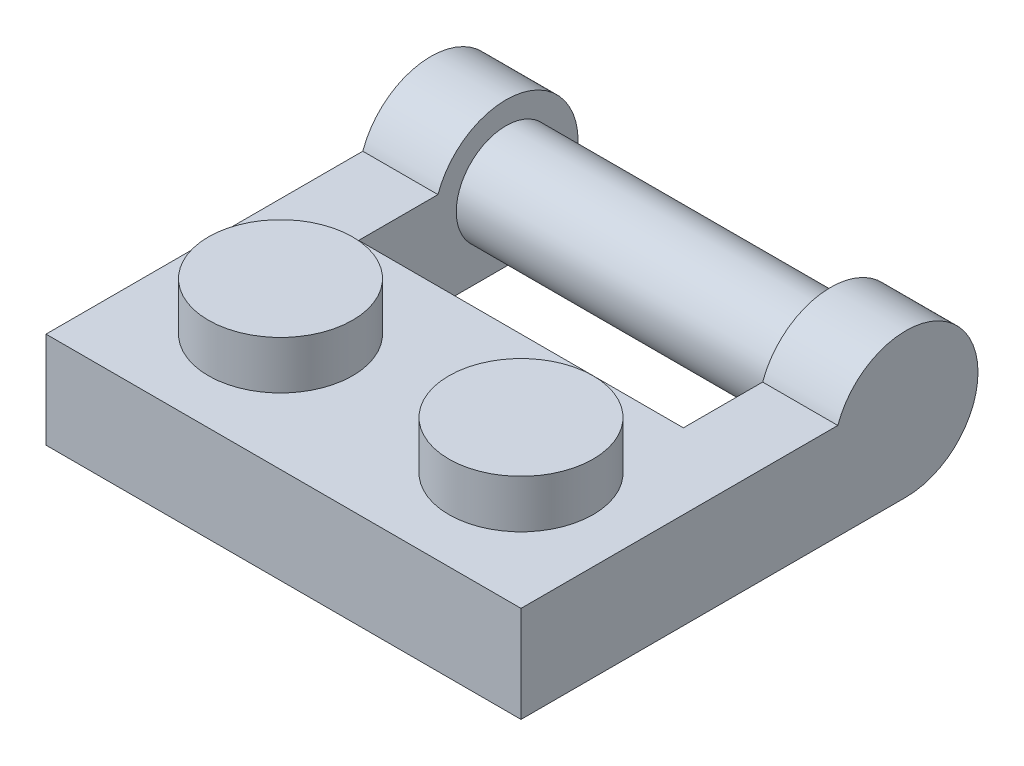
ISO-10303-21;
HEADER;
FILE_DESCRIPTION(('STEP AP214'),'2;1');
FILE_NAME('part.step','',(''),(''),'','','');
FILE_SCHEMA(('AUTOMOTIVE_DESIGN { 1 0 10303 214 1 1 1 1 }'));
ENDSEC;
DATA;
#1=APPLICATION_CONTEXT('core data for automotive mechanical design processes');
#2=APPLICATION_PROTOCOL_DEFINITION('international standard','automotive_design',2000,#1);
#3=PRODUCT_CONTEXT('',#1,'mechanical');
#4=PRODUCT('Part','Part','',(#3));
#5=PRODUCT_RELATED_PRODUCT_CATEGORY('part','',(#4));
#6=PRODUCT_DEFINITION_FORMATION('','',#4);
#7=PRODUCT_DEFINITION_CONTEXT('part definition',#1,'design');
#8=PRODUCT_DEFINITION('design','',#6,#7);
#9=PRODUCT_DEFINITION_SHAPE('','',#8);
#10=(LENGTH_UNIT() NAMED_UNIT(*) SI_UNIT(.MILLI.,.METRE.));
#11=(NAMED_UNIT(*) PLANE_ANGLE_UNIT() SI_UNIT($,.RADIAN.));
#12=(NAMED_UNIT(*) SI_UNIT($,.STERADIAN.) SOLID_ANGLE_UNIT());
#13=UNCERTAINTY_MEASURE_WITH_UNIT(LENGTH_MEASURE(1.E-05),#10,'distance_accuracy_value','');
#14=(GEOMETRIC_REPRESENTATION_CONTEXT(3) GLOBAL_UNCERTAINTY_ASSIGNED_CONTEXT((#13)) GLOBAL_UNIT_ASSIGNED_CONTEXT((#10,
#11,#12)) REPRESENTATION_CONTEXT('',''));
#15=CARTESIAN_POINT('',(0.,0.,0.));
#16=DIRECTION('',(0.,0.,1.));
#17=DIRECTION('',(1.,0.,0.));
#18=AXIS2_PLACEMENT_3D('',#15,#16,#17);
#19=CARTESIAN_POINT('',(8.58196721311474,35.7679015680186,0.));
#20=DIRECTION('',(0.,0.,-1.));
#21=DIRECTION('',(-1.,0.,0.));
#22=AXIS2_PLACEMENT_3D('',#19,#20,#21);
#23=PLANE('',#22);
#24=DIRECTION('',(0.,1.,0.));
#25=VECTOR('',#24,1.);
#26=CARTESIAN_POINT('',(13.9819672131147,0.,0.));
#27=LINE('',#26,#25);
#28=CARTESIAN_POINT('',(13.9819672131147,2.,0.));
#29=VERTEX_POINT('',#28);
#30=CARTESIAN_POINT('',(13.9819672131147,3.2,0.));
#31=VERTEX_POINT('',#30);
#32=EDGE_CURVE('E160',#29,#31,#27,.T.);
#33=ORIENTED_EDGE('',*,*,#32,.F.);
#34=DIRECTION('',(1.,0.,0.));
#35=VECTOR('',#34,1.);
#36=CARTESIAN_POINT('',(0.681967213114738,2.,0.));
#37=LINE('',#36,#35);
#38=CARTESIAN_POINT('',(3.18196721311474,2.,0.));
#39=VERTEX_POINT('',#38);
#40=EDGE_CURVE('E271',#39,#29,#37,.T.);
#41=ORIENTED_EDGE('',*,*,#40,.F.);
#42=DIRECTION('',(0.,1.,0.));
#43=VECTOR('',#42,1.);
#44=CARTESIAN_POINT('',(3.18196721311474,0.,0.));
#45=LINE('',#44,#43);
#46=CARTESIAN_POINT('',(3.18196721311474,3.2,0.));
#47=VERTEX_POINT('',#46);
#48=EDGE_CURVE('E176',#39,#47,#45,.T.);
#49=ORIENTED_EDGE('',*,*,#48,.T.);
#50=DIRECTION('',(1.,0.,0.));
#51=VECTOR('',#50,1.);
#52=CARTESIAN_POINT('',(0.681967213114738,3.2,0.));
#53=LINE('',#52,#51);
#54=EDGE_CURVE('E205',#47,#31,#53,.T.);
#55=ORIENTED_EDGE('',*,*,#54,.T.);
#56=EDGE_LOOP('',(#33,#41,#49,#55));
#57=FACE_BOUND('',#56,.T.);
#58=ADVANCED_FACE('F41',(#57),#23,.T.);
#59=CARTESIAN_POINT('',(16.4819672131147,0.,7.9));
#60=DIRECTION('',(-1.,0.,0.));
#61=DIRECTION('',(0.,0.,1.));
#62=AXIS2_PLACEMENT_3D('',#59,#60,#61);
#63=PLANE('',#62);
#64=DIRECTION('',(0.,0.,-1.));
#65=VECTOR('',#64,1.);
#66=CARTESIAN_POINT('',(16.4819672131147,0.,7.9));
#67=LINE('',#66,#65);
#68=CARTESIAN_POINT('',(16.4819672131147,0.,7.9));
#69=VERTEX_POINT('',#68);
#70=CARTESIAN_POINT('',(16.4819672131147,0.,-4.9));
#71=VERTEX_POINT('',#70);
#72=EDGE_CURVE('E254',#69,#71,#67,.T.);
#73=ORIENTED_EDGE('',*,*,#72,.T.);
#74=CARTESIAN_POINT('',(16.4819672131147,2.4,-4.9));
#75=DIRECTION('',(-1.,0.,0.));
#76=DIRECTION('',(0.,0.,-1.));
#77=AXIS2_PLACEMENT_3D('',#74,#75,#76);
#78=CIRCLE('',#77,2.4);
#79=CARTESIAN_POINT('',(16.4819672131147,3.2,-2.63725830020305));
#80=VERTEX_POINT('',#79);
#81=EDGE_CURVE('E162',#80,#71,#78,.T.);
#82=ORIENTED_EDGE('',*,*,#81,.F.);
#83=DIRECTION('',(0.,0.,-1.));
#84=VECTOR('',#83,1.);
#85=CARTESIAN_POINT('',(16.4819672131147,3.2,7.9));
#86=LINE('',#85,#84);
#87=CARTESIAN_POINT('',(16.4819672131147,3.2,7.9));
#88=VERTEX_POINT('',#87);
#89=EDGE_CURVE('E252',#88,#80,#86,.T.);
#90=ORIENTED_EDGE('',*,*,#89,.F.);
#91=DIRECTION('',(0.,1.,0.));
#92=VECTOR('',#91,1.);
#93=CARTESIAN_POINT('',(16.4819672131147,0.,7.9));
#94=LINE('',#93,#92);
#95=EDGE_CURVE('E246',#69,#88,#94,.T.);
#96=ORIENTED_EDGE('',*,*,#95,.F.);
#97=EDGE_LOOP('',(#73,#82,#90,#96));
#98=FACE_BOUND('',#97,.T.);
#99=ADVANCED_FACE('F306',(#98),#63,.F.);
#100=CARTESIAN_POINT('',(0.681967213114738,0.,7.9));
#101=DIRECTION('',(0.,1.,0.));
#102=DIRECTION('',(0.,0.,1.));
#103=AXIS2_PLACEMENT_3D('',#100,#101,#102);
#104=PLANE('',#103);
#105=DIRECTION('',(0.,0.,-1.));
#106=VECTOR('',#105,1.);
#107=CARTESIAN_POINT('',(0.681967213114738,0.,7.9));
#108=LINE('',#107,#106);
#109=CARTESIAN_POINT('',(0.681967213114738,0.,7.9));
#110=VERTEX_POINT('',#109);
#111=CARTESIAN_POINT('',(0.681967213114738,0.,-4.9));
#112=VERTEX_POINT('',#111);
#113=EDGE_CURVE('E256',#110,#112,#108,.T.);
#114=ORIENTED_EDGE('',*,*,#113,.T.);
#115=DIRECTION('',(-1.,0.,0.));
#116=VECTOR('',#115,1.);
#117=CARTESIAN_POINT('',(3.18196721311474,0.,-4.9));
#118=LINE('',#117,#116);
#119=CARTESIAN_POINT('',(3.18196721311474,0.,-4.9));
#120=VERTEX_POINT('',#119);
#121=EDGE_CURVE('E191',#120,#112,#118,.T.);
#122=ORIENTED_EDGE('',*,*,#121,.F.);
#123=DIRECTION('',(0.,0.,1.));
#124=VECTOR('',#123,1.);
#125=CARTESIAN_POINT('',(3.18196721311474,0.,0.));
#126=LINE('',#125,#124);
#127=CARTESIAN_POINT('',(3.18196721311474,0.,0.));
#128=VERTEX_POINT('',#127);
#129=EDGE_CURVE('E181',#120,#128,#126,.T.);
#130=ORIENTED_EDGE('',*,*,#129,.T.);
#131=DIRECTION('',(-1.,0.,0.));
#132=VECTOR('',#131,1.);
#133=CARTESIAN_POINT('',(3.18196721311474,0.,0.));
#134=LINE('',#133,#132);
#135=CARTESIAN_POINT('',(1.88196721311474,0.,0.));
#136=VERTEX_POINT('',#135);
#137=EDGE_CURVE('E187',#128,#136,#134,.T.);
#138=ORIENTED_EDGE('',*,*,#137,.T.);
#139=DIRECTION('',(0.,0.,-1.));
#140=VECTOR('',#139,1.);
#141=CARTESIAN_POINT('',(1.88196721311474,0.,7.9));
#142=LINE('',#141,#140);
#143=CARTESIAN_POINT('',(1.88196721311474,0.,6.7));
#144=VERTEX_POINT('',#143);
#145=EDGE_CURVE('E219',#144,#136,#142,.T.);
#146=ORIENTED_EDGE('',*,*,#145,.F.);
#147=DIRECTION('',(1.,0.,0.));
#148=VECTOR('',#147,1.);
#149=CARTESIAN_POINT('',(0.,0.,6.7));
#150=LINE('',#149,#148);
#151=CARTESIAN_POINT('',(15.2819672131147,0.,6.7));
#152=VERTEX_POINT('',#151);
#153=EDGE_CURVE('E231',#144,#152,#150,.T.);
#154=ORIENTED_EDGE('',*,*,#153,.T.);
#155=DIRECTION('',(0.,0.,-1.));
#156=VECTOR('',#155,1.);
#157=CARTESIAN_POINT('',(15.2819672131147,0.,7.9));
#158=LINE('',#157,#156);
#159=CARTESIAN_POINT('',(15.2819672131147,0.,0.));
#160=VERTEX_POINT('',#159);
#161=EDGE_CURVE('E154',#152,#160,#158,.T.);
#162=ORIENTED_EDGE('',*,*,#161,.T.);
#163=DIRECTION('',(1.,0.,0.));
#164=VECTOR('',#163,1.);
#165=CARTESIAN_POINT('',(13.9819672131147,0.,0.));
#166=LINE('',#165,#164);
#167=CARTESIAN_POINT('',(13.9819672131147,0.,0.));
#168=VERTEX_POINT('',#167);
#169=EDGE_CURVE('E151',#168,#160,#166,.T.);
#170=ORIENTED_EDGE('',*,*,#169,.F.);
#171=DIRECTION('',(0.,0.,1.));
#172=VECTOR('',#171,1.);
#173=CARTESIAN_POINT('',(13.9819672131147,0.,0.));
#174=LINE('',#173,#172);
#175=CARTESIAN_POINT('',(13.9819672131147,0.,-4.9));
#176=VERTEX_POINT('',#175);
#177=EDGE_CURVE('E138',#176,#168,#174,.T.);
#178=ORIENTED_EDGE('',*,*,#177,.F.);
#179=DIRECTION('',(1.,0.,0.));
#180=VECTOR('',#179,1.);
#181=CARTESIAN_POINT('',(13.9819672131147,0.,-4.9));
#182=LINE('',#181,#180);
#183=EDGE_CURVE('E155',#176,#71,#182,.T.);
#184=ORIENTED_EDGE('',*,*,#183,.T.);
#185=ORIENTED_EDGE('',*,*,#72,.F.);
#186=DIRECTION('',(1.,0.,0.));
#187=VECTOR('',#186,1.);
#188=CARTESIAN_POINT('',(0.681967213114738,0.,7.9));
#189=LINE('',#188,#187);
#190=EDGE_CURVE('E244',#110,#69,#189,.T.);
#191=ORIENTED_EDGE('',*,*,#190,.F.);
#192=EDGE_LOOP('',(#114,#122,#130,#138,#146,#154,#162,#170,#178,#184,#185,#191));
#193=FACE_BOUND('',#192,.T.);
#194=ADVANCED_FACE('F152',(#193),#104,.F.);
#195=CARTESIAN_POINT('',(0.681967213114738,3.2,7.9));
#196=DIRECTION('',(0.,-1.,0.));
#197=DIRECTION('',(1.,0.,0.));
#198=AXIS2_PLACEMENT_3D('',#195,#196,#197);
#199=PLANE('',#198);
#200=CARTESIAN_POINT('',(12.5819672131147,3.2,4.));
#201=DIRECTION('',(0.,-1.,0.));
#202=DIRECTION('',(1.,0.,0.));
#203=AXIS2_PLACEMENT_3D('',#200,#201,#202);
#204=CIRCLE('',#203,2.4);
#205=CARTESIAN_POINT('',(14.9819672131147,3.2,4.));
#206=VERTEX_POINT('',#205);
#207=EDGE_CURVE('E261',#206,#206,#204,.F.);
#208=ORIENTED_EDGE('',*,*,#207,.F.);
#209=EDGE_LOOP('',(#208));
#210=FACE_BOUND('',#209,.T.);
#211=CARTESIAN_POINT('',(4.58196721311474,3.2,4.));
#212=DIRECTION('',(0.,-1.,0.));
#213=DIRECTION('',(1.,0.,0.));
#214=AXIS2_PLACEMENT_3D('',#211,#212,#213);
#215=CIRCLE('',#214,2.4);
#216=CARTESIAN_POINT('',(6.98196721311474,3.2,4.));
#217=VERTEX_POINT('',#216);
#218=EDGE_CURVE('E258',#217,#217,#215,.F.);
#219=ORIENTED_EDGE('',*,*,#218,.F.);
#220=EDGE_LOOP('',(#219));
#221=FACE_BOUND('',#220,.T.);
#222=ORIENTED_EDGE('',*,*,#54,.F.);
#223=DIRECTION('',(0.,0.,-1.));
#224=VECTOR('',#223,1.);
#225=CARTESIAN_POINT('',(3.18196721311474,3.2,0.));
#226=LINE('',#225,#224);
#227=CARTESIAN_POINT('',(3.18196721311474,3.2,-2.63725830020305));
#228=VERTEX_POINT('',#227);
#229=EDGE_CURVE('E57',#47,#228,#226,.T.);
#230=ORIENTED_EDGE('',*,*,#229,.T.);
#231=DIRECTION('',(-1.,0.,0.));
#232=VECTOR('',#231,1.);
#233=CARTESIAN_POINT('',(3.18196721311474,3.2,-2.63725830020305));
#234=LINE('',#233,#232);
#235=CARTESIAN_POINT('',(0.681967213114738,3.2,-2.63725830020305));
#236=VERTEX_POINT('',#235);
#237=EDGE_CURVE('E184',#228,#236,#234,.T.);
#238=ORIENTED_EDGE('',*,*,#237,.T.);
#239=DIRECTION('',(0.,0.,-1.));
#240=VECTOR('',#239,1.);
#241=CARTESIAN_POINT('',(0.681967213114738,3.2,7.9));
#242=LINE('',#241,#240);
#243=CARTESIAN_POINT('',(0.681967213114738,3.2,7.9));
#244=VERTEX_POINT('',#243);
#245=EDGE_CURVE('E250',#244,#236,#242,.T.);
#246=ORIENTED_EDGE('',*,*,#245,.F.);
#247=DIRECTION('',(-1.,0.,0.));
#248=VECTOR('',#247,1.);
#249=CARTESIAN_POINT('',(0.681967213114738,3.2,7.9));
#250=LINE('',#249,#248);
#251=EDGE_CURVE('E248',#88,#244,#250,.T.);
#252=ORIENTED_EDGE('',*,*,#251,.F.);
#253=ORIENTED_EDGE('',*,*,#89,.T.);
#254=DIRECTION('',(1.,0.,0.));
#255=VECTOR('',#254,1.);
#256=CARTESIAN_POINT('',(13.9819672131147,3.2,-2.63725830020305));
#257=LINE('',#256,#255);
#258=CARTESIAN_POINT('',(13.9819672131147,3.2,-2.63725830020305));
#259=VERTEX_POINT('',#258);
#260=EDGE_CURVE('E168',#259,#80,#257,.T.);
#261=ORIENTED_EDGE('',*,*,#260,.F.);
#262=DIRECTION('',(0.,0.,-1.));
#263=VECTOR('',#262,1.);
#264=CARTESIAN_POINT('',(13.9819672131147,3.2,0.));
#265=LINE('',#264,#263);
#266=EDGE_CURVE('E156',#31,#259,#265,.T.);
#267=ORIENTED_EDGE('',*,*,#266,.F.);
#268=EDGE_LOOP('',(#222,#230,#238,#246,#252,#253,#261,#267));
#269=FACE_BOUND('',#268,.T.);
#270=ADVANCED_FACE('F332',(#210,#221,#269),#199,.F.);
#271=CARTESIAN_POINT('',(15.2819672131147,0.,7.9));
#272=DIRECTION('',(-1.,0.,0.));
#273=DIRECTION('',(0.,0.,1.));
#274=AXIS2_PLACEMENT_3D('',#271,#272,#273);
#275=PLANE('',#274);
#276=DIRECTION('',(0.,0.,-1.));
#277=VECTOR('',#276,1.);
#278=CARTESIAN_POINT('',(15.2819672131147,2.,7.9));
#279=LINE('',#278,#277);
#280=CARTESIAN_POINT('',(15.2819672131147,2.,6.7));
#281=VERTEX_POINT('',#280);
#282=CARTESIAN_POINT('',(15.2819672131147,2.,0.));
#283=VERTEX_POINT('',#282);
#284=EDGE_CURVE('E223',#281,#283,#279,.T.);
#285=ORIENTED_EDGE('',*,*,#284,.T.);
#286=DIRECTION('',(0.,-1.,0.));
#287=VECTOR('',#286,1.);
#288=CARTESIAN_POINT('',(15.2819672131147,0.,0.));
#289=LINE('',#288,#287);
#290=EDGE_CURVE('E65',#283,#160,#289,.T.);
#291=ORIENTED_EDGE('',*,*,#290,.T.);
#292=ORIENTED_EDGE('',*,*,#161,.F.);
#293=DIRECTION('',(0.,1.,0.));
#294=VECTOR('',#293,1.);
#295=CARTESIAN_POINT('',(15.2819672131147,0.,6.7));
#296=LINE('',#295,#294);
#297=EDGE_CURVE('E226',#152,#281,#296,.T.);
#298=ORIENTED_EDGE('',*,*,#297,.T.);
#299=EDGE_LOOP('',(#285,#291,#292,#298));
#300=FACE_BOUND('',#299,.T.);
#301=ADVANCED_FACE('F330',(#300),#275,.T.);
#302=CARTESIAN_POINT('',(0.681967213114738,2.,7.9));
#303=DIRECTION('',(0.,-1.,0.));
#304=DIRECTION('',(1.,0.,0.));
#305=AXIS2_PLACEMENT_3D('',#302,#303,#304);
#306=PLANE('',#305);
#307=CARTESIAN_POINT('',(8.58196721311474,2.,4.));
#308=DIRECTION('',(0.,-1.,0.));
#309=DIRECTION('',(1.,0.,0.));
#310=AXIS2_PLACEMENT_3D('',#307,#308,#309);
#311=CIRCLE('',#310,1.75);
#312=CARTESIAN_POINT('',(10.3319672131147,2.,4.));
#313=VERTEX_POINT('',#312);
#314=EDGE_CURVE('E201',#313,#313,#311,.F.);
#315=ORIENTED_EDGE('',*,*,#314,.T.);
#316=EDGE_LOOP('',(#315));
#317=FACE_BOUND('',#316,.T.);
#318=DIRECTION('',(0.,0.,-1.));
#319=VECTOR('',#318,1.);
#320=CARTESIAN_POINT('',(1.88196721311474,2.,7.9));
#321=LINE('',#320,#319);
#322=CARTESIAN_POINT('',(1.88196721311474,2.,6.7));
#323=VERTEX_POINT('',#322);
#324=CARTESIAN_POINT('',(1.88196721311474,2.,0.));
#325=VERTEX_POINT('',#324);
#326=EDGE_CURVE('E220',#323,#325,#321,.T.);
#327=ORIENTED_EDGE('',*,*,#326,.T.);
#328=EDGE_CURVE('E267',#325,#39,#37,.T.);
#329=ORIENTED_EDGE('',*,*,#328,.T.);
#330=ORIENTED_EDGE('',*,*,#40,.T.);
#331=EDGE_CURVE('E159',#29,#283,#37,.T.);
#332=ORIENTED_EDGE('',*,*,#331,.T.);
#333=ORIENTED_EDGE('',*,*,#284,.F.);
#334=DIRECTION('',(-1.,0.,0.));
#335=VECTOR('',#334,1.);
#336=CARTESIAN_POINT('',(0.,2.,6.7));
#337=LINE('',#336,#335);
#338=EDGE_CURVE('E224',#281,#323,#337,.T.);
#339=ORIENTED_EDGE('',*,*,#338,.T.);
#340=EDGE_LOOP('',(#327,#329,#330,#332,#333,#339));
#341=FACE_BOUND('',#340,.T.);
#342=CARTESIAN_POINT('',(12.5819672131147,2.,4.));
#343=DIRECTION('',(0.,-1.,0.));
#344=DIRECTION('',(1.,0.,0.));
#345=AXIS2_PLACEMENT_3D('',#342,#343,#344);
#346=CIRCLE('',#345,1.2);
#347=CARTESIAN_POINT('',(13.7819672131147,2.,4.));
#348=VERTEX_POINT('',#347);
#349=EDGE_CURVE('E213',#348,#348,#346,.F.);
#350=ORIENTED_EDGE('',*,*,#349,.T.);
#351=EDGE_LOOP('',(#350));
#352=FACE_BOUND('',#351,.T.);
#353=CARTESIAN_POINT('',(4.58196721311474,2.,4.));
#354=DIRECTION('',(0.,-1.,0.));
#355=DIRECTION('',(1.,0.,0.));
#356=AXIS2_PLACEMENT_3D('',#353,#354,#355);
#357=CIRCLE('',#356,1.2);
#358=CARTESIAN_POINT('',(5.78196721311474,2.,4.));
#359=VERTEX_POINT('',#358);
#360=EDGE_CURVE('E216',#359,#359,#357,.F.);
#361=ORIENTED_EDGE('',*,*,#360,.T.);
#362=EDGE_LOOP('',(#361));
#363=FACE_BOUND('',#362,.T.);
#364=ADVANCED_FACE('F276',(#317,#341,#352,#363),#306,.T.);
#365=CARTESIAN_POINT('',(12.5819672131147,4.8,4.));
#366=DIRECTION('',(0.,1.,0.));
#367=DIRECTION('',(0.,0.,1.));
#368=AXIS2_PLACEMENT_3D('',#365,#366,#367);
#369=PLANE('',#368);
#370=CARTESIAN_POINT('',(12.5819672131147,4.8,4.));
#371=DIRECTION('',(0.,1.,0.));
#372=DIRECTION('',(0.,0.,1.));
#373=AXIS2_PLACEMENT_3D('',#370,#371,#372);
#374=CIRCLE('',#373,2.4);
#375=CARTESIAN_POINT('',(12.5819672131147,4.8,6.4));
#376=VERTEX_POINT('',#375);
#377=EDGE_CURVE('E264',#376,#376,#374,.T.);
#378=ORIENTED_EDGE('',*,*,#377,.T.);
#379=EDGE_LOOP('',(#378));
#380=FACE_BOUND('',#379,.T.);
#381=ADVANCED_FACE('F43',(#380),#369,.T.);
#382=CARTESIAN_POINT('',(12.5819672131147,4.8,4.));
#383=DIRECTION('',(0.,-1.,0.));
#384=DIRECTION('',(0.,0.,-1.));
#385=AXIS2_PLACEMENT_3D('',#382,#383,#384);
#386=CYLINDRICAL_SURFACE('',#385,2.4);
#387=ORIENTED_EDGE('',*,*,#377,.F.);
#388=EDGE_LOOP('',(#387));
#389=FACE_BOUND('',#388,.T.);
#390=ORIENTED_EDGE('',*,*,#207,.T.);
#391=EDGE_LOOP('',(#390));
#392=FACE_BOUND('',#391,.T.);
#393=ADVANCED_FACE('F364',(#389,#392),#386,.T.);
#394=CARTESIAN_POINT('',(0.681967213114738,0.,7.9));
#395=DIRECTION('',(1.,0.,0.));
#396=DIRECTION('',(0.,0.,-1.));
#397=AXIS2_PLACEMENT_3D('',#394,#395,#396);
#398=PLANE('',#397);
#399=ORIENTED_EDGE('',*,*,#245,.T.);
#400=CARTESIAN_POINT('',(0.681967213114738,2.4,-4.9));
#401=DIRECTION('',(-1.,0.,0.));
#402=DIRECTION('',(0.,0.,-1.));
#403=AXIS2_PLACEMENT_3D('',#400,#401,#402);
#404=CIRCLE('',#403,2.4);
#405=EDGE_CURVE('E171',#236,#112,#404,.T.);
#406=ORIENTED_EDGE('',*,*,#405,.T.);
#407=ORIENTED_EDGE('',*,*,#113,.F.);
#408=DIRECTION('',(0.,-1.,0.));
#409=VECTOR('',#408,1.);
#410=CARTESIAN_POINT('',(0.681967213114738,0.,7.9));
#411=LINE('',#410,#409);
#412=EDGE_CURVE('E241',#244,#110,#411,.T.);
#413=ORIENTED_EDGE('',*,*,#412,.F.);
#414=EDGE_LOOP('',(#399,#406,#407,#413));
#415=FACE_BOUND('',#414,.T.);
#416=ADVANCED_FACE('F356',(#415),#398,.F.);
#417=CARTESIAN_POINT('',(0.,0.,7.9));
#418=DIRECTION('',(0.,0.,-1.));
#419=DIRECTION('',(-1.,0.,0.));
#420=AXIS2_PLACEMENT_3D('',#417,#418,#419);
#421=PLANE('',#420);
#422=ORIENTED_EDGE('',*,*,#412,.T.);
#423=ORIENTED_EDGE('',*,*,#190,.T.);
#424=ORIENTED_EDGE('',*,*,#95,.T.);
#425=ORIENTED_EDGE('',*,*,#251,.T.);
#426=EDGE_LOOP('',(#422,#423,#424,#425));
#427=FACE_BOUND('',#426,.T.);
#428=ADVANCED_FACE('F352',(#427),#421,.F.);
#429=CARTESIAN_POINT('',(4.58196721311474,4.8,4.));
#430=DIRECTION('',(0.,-1.,0.));
#431=DIRECTION('',(0.,0.,-1.));
#432=AXIS2_PLACEMENT_3D('',#429,#430,#431);
#433=CYLINDRICAL_SURFACE('',#432,2.4);
#434=CARTESIAN_POINT('',(4.58196721311474,4.8,4.));
#435=DIRECTION('',(0.,1.,0.));
#436=DIRECTION('',(0.,0.,1.));
#437=AXIS2_PLACEMENT_3D('',#434,#435,#436);
#438=CIRCLE('',#437,2.4);
#439=CARTESIAN_POINT('',(4.58196721311474,4.8,6.4));
#440=VERTEX_POINT('',#439);
#441=EDGE_CURVE('E212',#440,#440,#438,.T.);
#442=ORIENTED_EDGE('',*,*,#441,.F.);
#443=EDGE_LOOP('',(#442));
#444=FACE_BOUND('',#443,.T.);
#445=ORIENTED_EDGE('',*,*,#218,.T.);
#446=EDGE_LOOP('',(#445));
#447=FACE_BOUND('',#446,.T.);
#448=ADVANCED_FACE('F348',(#444,#447),#433,.T.);
#449=CARTESIAN_POINT('',(4.58196721311474,4.8,4.));
#450=DIRECTION('',(0.,1.,0.));
#451=DIRECTION('',(0.,0.,1.));
#452=AXIS2_PLACEMENT_3D('',#449,#450,#451);
#453=PLANE('',#452);
#454=ORIENTED_EDGE('',*,*,#441,.T.);
#455=EDGE_LOOP('',(#454));
#456=FACE_BOUND('',#455,.T.);
#457=ADVANCED_FACE('F320',(#456),#453,.T.);
#458=CARTESIAN_POINT('',(12.5819672131147,3.6,4.));
#459=DIRECTION('',(0.,1.,0.));
#460=DIRECTION('',(0.,0.,1.));
#461=AXIS2_PLACEMENT_3D('',#458,#459,#460);
#462=PLANE('',#461);
#463=CARTESIAN_POINT('',(12.5819672131147,3.6,4.));
#464=DIRECTION('',(0.,1.,0.));
#465=DIRECTION('',(0.,0.,1.));
#466=AXIS2_PLACEMENT_3D('',#463,#464,#465);
#467=CIRCLE('',#466,1.2);
#468=CARTESIAN_POINT('',(12.5819672131147,3.6,5.2));
#469=VERTEX_POINT('',#468);
#470=EDGE_CURVE('E209',#469,#469,#467,.T.);
#471=ORIENTED_EDGE('',*,*,#470,.F.);
#472=EDGE_LOOP('',(#471));
#473=FACE_BOUND('',#472,.T.);
#474=ADVANCED_FACE('F316',(#473),#462,.F.);
#475=CARTESIAN_POINT('',(12.5819672131147,4.8,4.));
#476=DIRECTION('',(0.,-1.,0.));
#477=DIRECTION('',(0.,0.,-1.));
#478=AXIS2_PLACEMENT_3D('',#475,#476,#477);
#479=CYLINDRICAL_SURFACE('',#478,1.2);
#480=ORIENTED_EDGE('',*,*,#470,.T.);
#481=EDGE_LOOP('',(#480));
#482=FACE_BOUND('',#481,.T.);
#483=ORIENTED_EDGE('',*,*,#349,.F.);
#484=EDGE_LOOP('',(#483));
#485=FACE_BOUND('',#484,.T.);
#486=ADVANCED_FACE('F319',(#482,#485),#479,.F.);
#487=CARTESIAN_POINT('',(1.88196721311474,0.,7.9));
#488=DIRECTION('',(1.,0.,0.));
#489=DIRECTION('',(0.,0.,-1.));
#490=AXIS2_PLACEMENT_3D('',#487,#488,#489);
#491=PLANE('',#490);
#492=DIRECTION('',(0.,-1.,0.));
#493=VECTOR('',#492,1.);
#494=CARTESIAN_POINT('',(1.88196721311474,0.,0.));
#495=LINE('',#494,#493);
#496=EDGE_CURVE('E202',#325,#136,#495,.T.);
#497=ORIENTED_EDGE('',*,*,#496,.F.);
#498=ORIENTED_EDGE('',*,*,#326,.F.);
#499=DIRECTION('',(0.,-1.,0.));
#500=VECTOR('',#499,1.);
#501=CARTESIAN_POINT('',(1.88196721311474,0.,6.7));
#502=LINE('',#501,#500);
#503=EDGE_CURVE('E229',#323,#144,#502,.T.);
#504=ORIENTED_EDGE('',*,*,#503,.T.);
#505=ORIENTED_EDGE('',*,*,#145,.T.);
#506=EDGE_LOOP('',(#497,#498,#504,#505));
#507=FACE_BOUND('',#506,.T.);
#508=ADVANCED_FACE('F324',(#507),#491,.T.);
#509=CARTESIAN_POINT('',(0.,0.,6.7));
#510=DIRECTION('',(0.,0.,-1.));
#511=DIRECTION('',(-1.,0.,0.));
#512=AXIS2_PLACEMENT_3D('',#509,#510,#511);
#513=PLANE('',#512);
#514=ORIENTED_EDGE('',*,*,#503,.F.);
#515=ORIENTED_EDGE('',*,*,#338,.F.);
#516=ORIENTED_EDGE('',*,*,#297,.F.);
#517=ORIENTED_EDGE('',*,*,#153,.F.);
#518=EDGE_LOOP('',(#514,#515,#516,#517));
#519=FACE_BOUND('',#518,.T.);
#520=ADVANCED_FACE('F328',(#519),#513,.T.);
#521=CARTESIAN_POINT('',(4.58196721311474,4.8,4.));
#522=DIRECTION('',(0.,-1.,0.));
#523=DIRECTION('',(0.,0.,-1.));
#524=AXIS2_PLACEMENT_3D('',#521,#522,#523);
#525=CYLINDRICAL_SURFACE('',#524,1.2);
#526=CARTESIAN_POINT('',(4.58196721311474,3.6,4.));
#527=DIRECTION('',(0.,1.,0.));
#528=DIRECTION('',(0.,0.,1.));
#529=AXIS2_PLACEMENT_3D('',#526,#527,#528);
#530=CIRCLE('',#529,1.2);
#531=CARTESIAN_POINT('',(4.58196721311474,3.6,5.2));
#532=VERTEX_POINT('',#531);
#533=EDGE_CURVE('E208',#532,#532,#530,.T.);
#534=ORIENTED_EDGE('',*,*,#533,.T.);
#535=EDGE_LOOP('',(#534));
#536=FACE_BOUND('',#535,.T.);
#537=ORIENTED_EDGE('',*,*,#360,.F.);
#538=EDGE_LOOP('',(#537));
#539=FACE_BOUND('',#538,.T.);
#540=ADVANCED_FACE('F338',(#536,#539),#525,.F.);
#541=CARTESIAN_POINT('',(4.58196721311474,3.6,4.));
#542=DIRECTION('',(0.,1.,0.));
#543=DIRECTION('',(0.,0.,1.));
#544=AXIS2_PLACEMENT_3D('',#541,#542,#543);
#545=PLANE('',#544);
#546=ORIENTED_EDGE('',*,*,#533,.F.);
#547=EDGE_LOOP('',(#546));
#548=FACE_BOUND('',#547,.T.);
#549=ADVANCED_FACE('F289',(#548),#545,.F.);
#550=CARTESIAN_POINT('',(8.58196721311474,0.200000000000001,4.));
#551=DIRECTION('',(0.,-1.,0.));
#552=DIRECTION('',(1.,0.,0.));
#553=AXIS2_PLACEMENT_3D('',#550,#551,#552);
#554=PLANE('',#553);
#555=CARTESIAN_POINT('',(8.58196721311474,0.200000000000001,4.));
#556=DIRECTION('',(0.,-1.,0.));
#557=DIRECTION('',(1.,0.,0.));
#558=AXIS2_PLACEMENT_3D('',#555,#556,#557);
#559=CIRCLE('',#558,1.75);
#560=CARTESIAN_POINT('',(10.3319672131147,0.200000000000001,4.));
#561=VERTEX_POINT('',#560);
#562=EDGE_CURVE('E198',#561,#561,#559,.T.);
#563=ORIENTED_EDGE('',*,*,#562,.T.);
#564=EDGE_LOOP('',(#563));
#565=FACE_BOUND('',#564,.T.);
#566=CARTESIAN_POINT('',(8.58196721311474,0.200000000000001,4.));
#567=DIRECTION('',(0.,-1.,0.));
#568=DIRECTION('',(1.,0.,0.));
#569=AXIS2_PLACEMENT_3D('',#566,#567,#568);
#570=CIRCLE('',#569,0.75);
#571=CARTESIAN_POINT('',(9.33196721311474,0.200000000000001,4.));
#572=VERTEX_POINT('',#571);
#573=EDGE_CURVE('E190',#572,#572,#570,.T.);
#574=ORIENTED_EDGE('',*,*,#573,.F.);
#575=EDGE_LOOP('',(#574));
#576=FACE_BOUND('',#575,.T.);
#577=ADVANCED_FACE('F283',(#565,#576),#554,.T.);
#578=CARTESIAN_POINT('',(8.58196721311474,0.200000000000001,4.));
#579=DIRECTION('',(0.,1.,0.));
#580=DIRECTION('',(-1.,0.,0.));
#581=AXIS2_PLACEMENT_3D('',#578,#579,#580);
#582=CYLINDRICAL_SURFACE('',#581,1.75);
#583=ORIENTED_EDGE('',*,*,#314,.F.);
#584=EDGE_LOOP('',(#583));
#585=FACE_BOUND('',#584,.T.);
#586=ORIENTED_EDGE('',*,*,#562,.F.);
#587=EDGE_LOOP('',(#586));
#588=FACE_BOUND('',#587,.T.);
#589=ADVANCED_FACE('F279',(#585,#588),#582,.T.);
#590=CARTESIAN_POINT('',(8.58196721311474,0.200000000000001,4.));
#591=DIRECTION('',(0.,1.,0.));
#592=DIRECTION('',(-1.,0.,0.));
#593=AXIS2_PLACEMENT_3D('',#590,#591,#592);
#594=CYLINDRICAL_SURFACE('',#593,0.75);
#595=CARTESIAN_POINT('',(8.58196721311474,2.,4.));
#596=DIRECTION('',(0.,-1.,0.));
#597=DIRECTION('',(1.,0.,0.));
#598=AXIS2_PLACEMENT_3D('',#595,#596,#597);
#599=CIRCLE('',#598,0.75);
#600=CARTESIAN_POINT('',(9.33196721311474,2.,4.));
#601=VERTEX_POINT('',#600);
#602=EDGE_CURVE('E270',#601,#601,#599,.F.);
#603=ORIENTED_EDGE('',*,*,#602,.T.);
#604=EDGE_LOOP('',(#603));
#605=FACE_BOUND('',#604,.T.);
#606=ORIENTED_EDGE('',*,*,#573,.T.);
#607=EDGE_LOOP('',(#606));
#608=FACE_BOUND('',#607,.T.);
#609=ADVANCED_FACE('F282',(#605,#608),#594,.F.);
#610=ORIENTED_EDGE('',*,*,#602,.F.);
#611=EDGE_LOOP('',(#610));
#612=FACE_BOUND('',#611,.T.);
#613=ADVANCED_FACE('F294',(#612),#306,.T.);
#614=CARTESIAN_POINT('',(3.18196721311474,0.,0.));
#615=DIRECTION('',(0.,0.,1.));
#616=DIRECTION('',(1.,0.,0.));
#617=AXIS2_PLACEMENT_3D('',#614,#615,#616);
#618=PLANE('',#617);
#619=ORIENTED_EDGE('',*,*,#328,.F.);
#620=ORIENTED_EDGE('',*,*,#496,.T.);
#621=ORIENTED_EDGE('',*,*,#137,.F.);
#622=EDGE_CURVE('E173',#128,#39,#45,.T.);
#623=ORIENTED_EDGE('',*,*,#622,.T.);
#624=EDGE_LOOP('',(#619,#620,#621,#623));
#625=FACE_BOUND('',#624,.T.);
#626=ADVANCED_FACE('F301',(#625),#618,.T.);
#627=CARTESIAN_POINT('',(3.18196721311474,2.4,-4.9));
#628=DIRECTION('',(-1.,0.,0.));
#629=DIRECTION('',(0.,0.,1.));
#630=AXIS2_PLACEMENT_3D('',#627,#628,#629);
#631=CYLINDRICAL_SURFACE('',#630,2.4);
#632=ORIENTED_EDGE('',*,*,#405,.F.);
#633=ORIENTED_EDGE('',*,*,#237,.F.);
#634=CARTESIAN_POINT('',(3.18196721311474,2.4,-4.9));
#635=DIRECTION('',(-1.,0.,0.));
#636=DIRECTION('',(0.,0.,-1.));
#637=AXIS2_PLACEMENT_3D('',#634,#635,#636);
#638=CIRCLE('',#637,2.4);
#639=EDGE_CURVE('E178',#228,#120,#638,.T.);
#640=ORIENTED_EDGE('',*,*,#639,.T.);
#641=ORIENTED_EDGE('',*,*,#121,.T.);
#642=EDGE_LOOP('',(#632,#633,#640,#641));
#643=FACE_BOUND('',#642,.T.);
#644=ADVANCED_FACE('F406',(#643),#631,.T.);
#645=CARTESIAN_POINT('',(3.18196721311474,2.4,-4.9));
#646=DIRECTION('',(1.,0.,0.));
#647=DIRECTION('',(0.,0.,-1.));
#648=AXIS2_PLACEMENT_3D('',#645,#646,#647);
#649=PLANE('',#648);
#650=CARTESIAN_POINT('',(3.18196721311474,2.4,-4.9));
#651=DIRECTION('',(1.,0.,0.));
#652=DIRECTION('',(0.,0.,-1.));
#653=AXIS2_PLACEMENT_3D('',#650,#651,#652);
#654=CIRCLE('',#653,1.65302540538418);
#655=CARTESIAN_POINT('',(3.18196721311474,2.4,-6.55302540538418));
#656=VERTEX_POINT('',#655);
#657=EDGE_CURVE('E11',#656,#656,#654,.T.);
#658=ORIENTED_EDGE('',*,*,#657,.F.);
#659=EDGE_LOOP('',(#658));
#660=FACE_BOUND('',#659,.T.);
#661=ORIENTED_EDGE('',*,*,#622,.F.);
#662=ORIENTED_EDGE('',*,*,#129,.F.);
#663=ORIENTED_EDGE('',*,*,#639,.F.);
#664=ORIENTED_EDGE('',*,*,#229,.F.);
#665=ORIENTED_EDGE('',*,*,#48,.F.);
#666=EDGE_LOOP('',(#661,#662,#663,#664,#665));
#667=FACE_BOUND('',#666,.T.);
#668=ADVANCED_FACE('F404',(#660,#667),#649,.T.);
#669=CARTESIAN_POINT('',(13.9819672131147,0.,0.));
#670=DIRECTION('',(0.,0.,-1.));
#671=DIRECTION('',(-1.,0.,0.));
#672=AXIS2_PLACEMENT_3D('',#669,#670,#671);
#673=PLANE('',#672);
#674=ORIENTED_EDGE('',*,*,#290,.F.);
#675=ORIENTED_EDGE('',*,*,#331,.F.);
#676=EDGE_CURVE('E142',#168,#29,#27,.T.);
#677=ORIENTED_EDGE('',*,*,#676,.F.);
#678=ORIENTED_EDGE('',*,*,#169,.T.);
#679=EDGE_LOOP('',(#674,#675,#677,#678));
#680=FACE_BOUND('',#679,.T.);
#681=ADVANCED_FACE('F158',(#680),#673,.F.);
#682=CARTESIAN_POINT('',(13.9819672131147,2.4,-4.9));
#683=DIRECTION('',(1.,0.,0.));
#684=DIRECTION('',(0.,0.,-1.));
#685=AXIS2_PLACEMENT_3D('',#682,#683,#684);
#686=CYLINDRICAL_SURFACE('',#685,2.4);
#687=ORIENTED_EDGE('',*,*,#81,.T.);
#688=ORIENTED_EDGE('',*,*,#183,.F.);
#689=CARTESIAN_POINT('',(13.9819672131147,2.4,-4.9));
#690=DIRECTION('',(-1.,0.,0.));
#691=DIRECTION('',(0.,0.,-1.));
#692=AXIS2_PLACEMENT_3D('',#689,#690,#691);
#693=CIRCLE('',#692,2.4);
#694=EDGE_CURVE('E145',#259,#176,#693,.T.);
#695=ORIENTED_EDGE('',*,*,#694,.F.);
#696=ORIENTED_EDGE('',*,*,#260,.T.);
#697=EDGE_LOOP('',(#687,#688,#695,#696));
#698=FACE_BOUND('',#697,.T.);
#699=ADVANCED_FACE('F390',(#698),#686,.T.);
#700=CARTESIAN_POINT('',(13.9819672131147,2.4,-4.9));
#701=DIRECTION('',(-1.,0.,0.));
#702=DIRECTION('',(0.,0.,-1.));
#703=AXIS2_PLACEMENT_3D('',#700,#701,#702);
#704=PLANE('',#703);
#705=CARTESIAN_POINT('',(13.9819672131147,2.4,-4.9));
#706=DIRECTION('',(-1.,0.,0.));
#707=DIRECTION('',(0.,0.,1.));
#708=AXIS2_PLACEMENT_3D('',#705,#706,#707);
#709=CIRCLE('',#708,1.65302540538418);
#710=CARTESIAN_POINT('',(13.9819672131147,2.4,-3.24697459461582));
#711=VERTEX_POINT('',#710);
#712=EDGE_CURVE('E45',#711,#711,#709,.T.);
#713=ORIENTED_EDGE('',*,*,#712,.F.);
#714=EDGE_LOOP('',(#713));
#715=FACE_BOUND('',#714,.T.);
#716=ORIENTED_EDGE('',*,*,#676,.T.);
#717=ORIENTED_EDGE('',*,*,#32,.T.);
#718=ORIENTED_EDGE('',*,*,#266,.T.);
#719=ORIENTED_EDGE('',*,*,#694,.T.);
#720=ORIENTED_EDGE('',*,*,#177,.T.);
#721=EDGE_LOOP('',(#716,#717,#718,#719,#720));
#722=FACE_BOUND('',#721,.T.);
#723=ADVANCED_FACE('F140',(#715,#722),#704,.T.);
#724=CARTESIAN_POINT('',(14.6819672131147,2.4,-4.9));
#725=DIRECTION('',(-1.,0.,0.));
#726=DIRECTION('',(0.,0.,1.));
#727=AXIS2_PLACEMENT_3D('',#724,#725,#726);
#728=CYLINDRICAL_SURFACE('',#727,1.65302540538418);
#729=ORIENTED_EDGE('',*,*,#657,.T.);
#730=EDGE_LOOP('',(#729));
#731=FACE_BOUND('',#730,.T.);
#732=ORIENTED_EDGE('',*,*,#712,.T.);
#733=EDGE_LOOP('',(#732));
#734=FACE_BOUND('',#733,.T.);
#735=ADVANCED_FACE('F387',(#731,#734),#728,.T.);
#736=CLOSED_SHELL('',(#58,#99,#194,#270,#301,#364,#381,#393,#416,#428,#448,#457,#474,#486,#508,
#520,#540,#549,#577,#589,#609,#613,#626,#644,#668,#681,#699,#723,#735));
#737=MANIFOLD_SOLID_BREP('B2',#736);
#738=ADVANCED_BREP_SHAPE_REPRESENTATION('',(#18,#737),#14);
#739=SHAPE_DEFINITION_REPRESENTATION(#9,#738);
ENDSEC;
END-ISO-10303-21;
